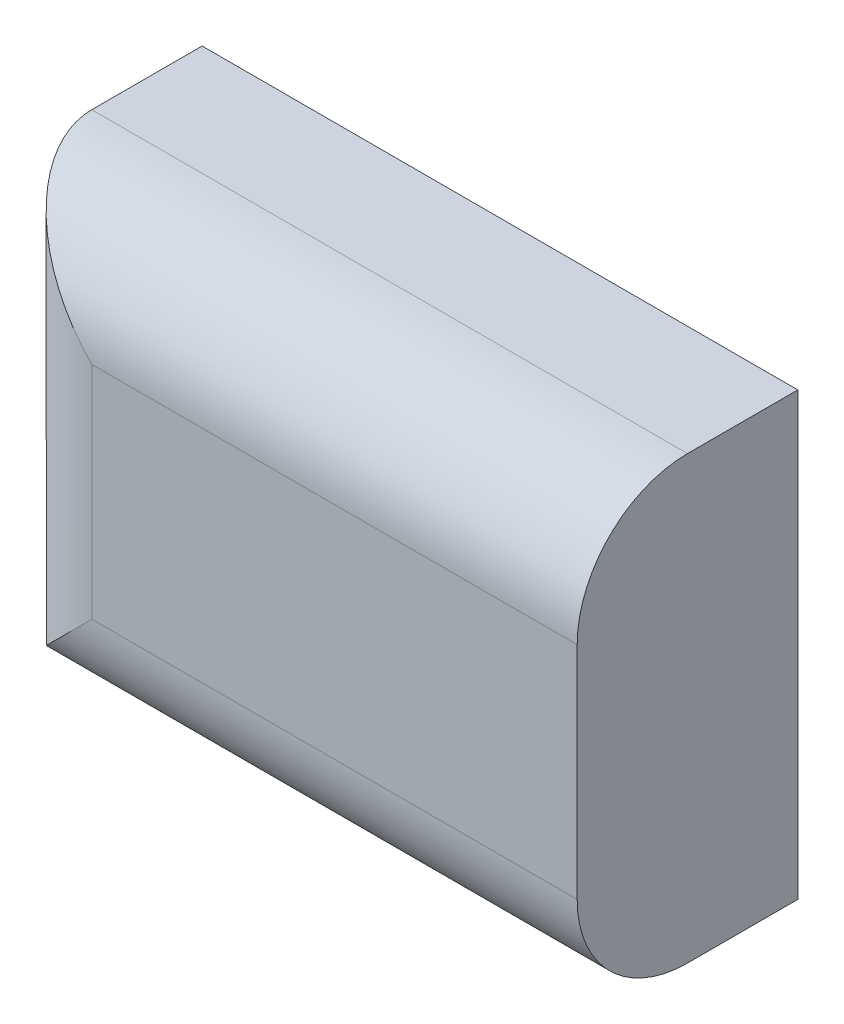
ISO-10303-21;
HEADER;
FILE_DESCRIPTION(('STEP AP214'),'2;1');
FILE_NAME('part.step','',(''),(''),'','','');
FILE_SCHEMA(('AUTOMOTIVE_DESIGN { 1 0 10303 214 1 1 1 1 }'));
ENDSEC;
DATA;
#1=APPLICATION_CONTEXT('core data for automotive mechanical design processes');
#2=APPLICATION_PROTOCOL_DEFINITION('international standard','automotive_design',2000,#1);
#3=PRODUCT_CONTEXT('',#1,'mechanical');
#4=PRODUCT('Part','Part','',(#3));
#5=PRODUCT_RELATED_PRODUCT_CATEGORY('part','',(#4));
#6=PRODUCT_DEFINITION_FORMATION('','',#4);
#7=PRODUCT_DEFINITION_CONTEXT('part definition',#1,'design');
#8=PRODUCT_DEFINITION('design','',#6,#7);
#9=PRODUCT_DEFINITION_SHAPE('','',#8);
#10=(LENGTH_UNIT() NAMED_UNIT(*) SI_UNIT(.MILLI.,.METRE.));
#11=(NAMED_UNIT(*) PLANE_ANGLE_UNIT() SI_UNIT($,.RADIAN.));
#12=(NAMED_UNIT(*) SI_UNIT($,.STERADIAN.) SOLID_ANGLE_UNIT());
#13=UNCERTAINTY_MEASURE_WITH_UNIT(LENGTH_MEASURE(1.E-05),#10,'distance_accuracy_value','');
#14=(GEOMETRIC_REPRESENTATION_CONTEXT(3) GLOBAL_UNCERTAINTY_ASSIGNED_CONTEXT((#13)) GLOBAL_UNIT_ASSIGNED_CONTEXT((#10,
#11,#12)) REPRESENTATION_CONTEXT('',''));
#15=CARTESIAN_POINT('',(0.,0.,0.));
#16=DIRECTION('',(0.,0.,1.));
#17=DIRECTION('',(1.,0.,0.));
#18=AXIS2_PLACEMENT_3D('',#15,#16,#17);
#19=CARTESIAN_POINT('',(171.45,-42.1410804547169,37.5167915155856));
#20=DIRECTION('',(0.,0.,-1.));
#21=DIRECTION('',(0.,1.,0.));
#22=AXIS2_PLACEMENT_3D('',#19,#20,#21);
#23=PLANE('',#22);
#24=DIRECTION('',(0.,-1.,0.));
#25=VECTOR('',#24,1.);
#26=CARTESIAN_POINT('',(31.75,-42.1410804547169,37.5167915155856));
#27=LINE('',#26,#25);
#28=CARTESIAN_POINT('',(31.75,53.1089195452831,37.5167915155856));
#29=VERTEX_POINT('',#28);
#30=CARTESIAN_POINT('',(31.75,-10.3910804547169,37.5167915155856));
#31=VERTEX_POINT('',#30);
#32=EDGE_CURVE('E119',#29,#31,#27,.T.);
#33=ORIENTED_EDGE('',*,*,#32,.T.);
#34=DIRECTION('',(-1.,0.,0.));
#35=VECTOR('',#34,1.);
#36=CARTESIAN_POINT('',(171.45,-10.3910804547169,37.5167915155856));
#37=LINE('',#36,#35);
#38=CARTESIAN_POINT('',(171.45,-10.3910804547169,37.5167915155856));
#39=VERTEX_POINT('',#38);
#40=EDGE_CURVE('E122',#31,#39,#37,.F.);
#41=ORIENTED_EDGE('',*,*,#40,.T.);
#42=DIRECTION('',(0.,-1.,0.));
#43=VECTOR('',#42,1.);
#44=CARTESIAN_POINT('',(171.45,-42.1410804547169,37.5167915155856));
#45=LINE('',#44,#43);
#46=CARTESIAN_POINT('',(171.45,53.1089195452831,37.5167915155856));
#47=VERTEX_POINT('',#46);
#48=EDGE_CURVE('E93',#47,#39,#45,.T.);
#49=ORIENTED_EDGE('',*,*,#48,.F.);
#50=DIRECTION('',(-1.,0.,0.));
#51=VECTOR('',#50,1.);
#52=CARTESIAN_POINT('',(171.45,53.1089195452831,37.5167915155856));
#53=LINE('',#52,#51);
#54=EDGE_CURVE('E102',#47,#29,#53,.T.);
#55=ORIENTED_EDGE('',*,*,#54,.T.);
#56=EDGE_LOOP('',(#33,#41,#49,#55));
#57=FACE_BOUND('',#56,.T.);
#58=ADVANCED_FACE('F33',(#57),#23,.F.);
#59=CARTESIAN_POINT('',(171.45,-42.1410804547169,37.5167915155856));
#60=DIRECTION('',(0.,1.,0.));
#61=DIRECTION('',(0.,0.,1.));
#62=AXIS2_PLACEMENT_3D('',#59,#60,#61);
#63=PLANE('',#62);
#64=DIRECTION('',(0.,0.,-1.));
#65=VECTOR('',#64,1.);
#66=CARTESIAN_POINT('',(171.45,-42.1410804547169,37.5167915155856));
#67=LINE('',#66,#65);
#68=CARTESIAN_POINT('',(171.45,-42.1410804547169,5.76679151558561));
#69=VERTEX_POINT('',#68);
#70=CARTESIAN_POINT('',(171.45,-42.1410804547169,-25.9832084844144));
#71=VERTEX_POINT('',#70);
#72=EDGE_CURVE('E85',#69,#71,#67,.T.);
#73=ORIENTED_EDGE('',*,*,#72,.F.);
#74=DIRECTION('',(-1.,0.,0.));
#75=VECTOR('',#74,1.);
#76=CARTESIAN_POINT('',(171.45,-42.1410804547169,5.76679151558561));
#77=LINE('',#76,#75);
#78=CARTESIAN_POINT('',(0.,-42.1410804547169,5.76679151558561));
#79=VERTEX_POINT('',#78);
#80=EDGE_CURVE('E126',#69,#79,#77,.T.);
#81=ORIENTED_EDGE('',*,*,#80,.T.);
#82=DIRECTION('',(0.,0.,-1.));
#83=VECTOR('',#82,1.);
#84=CARTESIAN_POINT('',(0.,-42.1410804547169,37.5167915155856));
#85=LINE('',#84,#83);
#86=CARTESIAN_POINT('',(0.,-42.1410804547169,-25.9832084844144));
#87=VERTEX_POINT('',#86);
#88=EDGE_CURVE('E99',#79,#87,#85,.T.);
#89=ORIENTED_EDGE('',*,*,#88,.T.);
#90=DIRECTION('',(-1.,0.,0.));
#91=VECTOR('',#90,1.);
#92=CARTESIAN_POINT('',(171.45,-42.1410804547169,-25.9832084844144));
#93=LINE('',#92,#91);
#94=EDGE_CURVE('E96',#71,#87,#93,.T.);
#95=ORIENTED_EDGE('',*,*,#94,.F.);
#96=EDGE_LOOP('',(#73,#81,#89,#95));
#97=FACE_BOUND('',#96,.T.);
#98=ADVANCED_FACE('F97',(#97),#63,.F.);
#99=CARTESIAN_POINT('',(171.45,84.8589195452831,-25.9832084844144));
#100=DIRECTION('',(0.,0.,1.));
#101=DIRECTION('',(0.,-1.,0.));
#102=AXIS2_PLACEMENT_3D('',#99,#100,#101);
#103=PLANE('',#102);
#104=DIRECTION('',(0.,1.,0.));
#105=VECTOR('',#104,1.);
#106=CARTESIAN_POINT('',(0.,84.8589195452831,-25.9832084844144));
#107=LINE('',#106,#105);
#108=CARTESIAN_POINT('',(0.,84.8589195452831,-25.9832084844144));
#109=VERTEX_POINT('',#108);
#110=EDGE_CURVE('E113',#87,#109,#107,.T.);
#111=ORIENTED_EDGE('',*,*,#110,.T.);
#112=DIRECTION('',(-1.,0.,0.));
#113=VECTOR('',#112,1.);
#114=CARTESIAN_POINT('',(171.45,84.8589195452831,-25.9832084844144));
#115=LINE('',#114,#113);
#116=CARTESIAN_POINT('',(171.45,84.8589195452831,-25.9832084844144));
#117=VERTEX_POINT('',#116);
#118=EDGE_CURVE('E103',#117,#109,#115,.T.);
#119=ORIENTED_EDGE('',*,*,#118,.F.);
#120=DIRECTION('',(0.,1.,0.));
#121=VECTOR('',#120,1.);
#122=CARTESIAN_POINT('',(171.45,84.8589195452831,-25.9832084844144));
#123=LINE('',#122,#121);
#124=EDGE_CURVE('E89',#71,#117,#123,.T.);
#125=ORIENTED_EDGE('',*,*,#124,.F.);
#126=ORIENTED_EDGE('',*,*,#94,.T.);
#127=EDGE_LOOP('',(#111,#119,#125,#126));
#128=FACE_BOUND('',#127,.T.);
#129=ADVANCED_FACE('F105',(#128),#103,.F.);
#130=CARTESIAN_POINT('',(171.45,84.8589195452831,-25.9832084844144));
#131=DIRECTION('',(0.,-1.,0.));
#132=DIRECTION('',(0.,0.,-1.));
#133=AXIS2_PLACEMENT_3D('',#130,#131,#132);
#134=PLANE('',#133);
#135=DIRECTION('',(0.,0.,1.));
#136=VECTOR('',#135,1.);
#137=CARTESIAN_POINT('',(0.,84.8589195452831,-25.9832084844144));
#138=LINE('',#137,#136);
#139=CARTESIAN_POINT('',(0.,84.8589195452831,5.76679151558562));
#140=VERTEX_POINT('',#139);
#141=EDGE_CURVE('E115',#109,#140,#138,.T.);
#142=ORIENTED_EDGE('',*,*,#141,.T.);
#143=DIRECTION('',(-1.,0.,0.));
#144=VECTOR('',#143,1.);
#145=CARTESIAN_POINT('',(171.45,84.8589195452831,5.76679151558562));
#146=LINE('',#145,#144);
#147=CARTESIAN_POINT('',(171.45,84.8589195452831,5.76679151558562));
#148=VERTEX_POINT('',#147);
#149=EDGE_CURVE('E11',#140,#148,#146,.F.);
#150=ORIENTED_EDGE('',*,*,#149,.T.);
#151=DIRECTION('',(0.,0.,1.));
#152=VECTOR('',#151,1.);
#153=CARTESIAN_POINT('',(171.45,84.8589195452831,-25.9832084844144));
#154=LINE('',#153,#152);
#155=EDGE_CURVE('E107',#117,#148,#154,.T.);
#156=ORIENTED_EDGE('',*,*,#155,.F.);
#157=ORIENTED_EDGE('',*,*,#118,.T.);
#158=EDGE_LOOP('',(#142,#150,#156,#157));
#159=FACE_BOUND('',#158,.T.);
#160=ADVANCED_FACE('F149',(#159),#134,.F.);
#161=CARTESIAN_POINT('',(171.45,0.,0.));
#162=DIRECTION('',(1.,0.,0.));
#163=DIRECTION('',(0.,0.,-1.));
#164=AXIS2_PLACEMENT_3D('',#161,#162,#163);
#165=PLANE('',#164);
#166=ORIENTED_EDGE('',*,*,#48,.T.);
#167=CARTESIAN_POINT('',(171.45,-10.3910804547169,5.76679151558561));
#168=DIRECTION('',(1.,0.,0.));
#169=DIRECTION('',(0.,0.,-1.));
#170=AXIS2_PLACEMENT_3D('',#167,#168,#169);
#171=CIRCLE('',#170,31.75);
#172=EDGE_CURVE('E42',#39,#69,#171,.T.);
#173=ORIENTED_EDGE('',*,*,#172,.T.);
#174=ORIENTED_EDGE('',*,*,#72,.T.);
#175=ORIENTED_EDGE('',*,*,#124,.T.);
#176=ORIENTED_EDGE('',*,*,#155,.T.);
#177=CARTESIAN_POINT('',(171.45,53.1089195452831,5.76679151558562));
#178=DIRECTION('',(1.,0.,0.));
#179=DIRECTION('',(0.,0.,-1.));
#180=AXIS2_PLACEMENT_3D('',#177,#178,#179);
#181=CIRCLE('',#180,31.75);
#182=EDGE_CURVE('E128',#148,#47,#181,.T.);
#183=ORIENTED_EDGE('',*,*,#182,.T.);
#184=EDGE_LOOP('',(#166,#173,#174,#175,#176,#183));
#185=FACE_BOUND('',#184,.T.);
#186=ADVANCED_FACE('F87',(#185),#165,.T.);
#187=CARTESIAN_POINT('',(0.,0.,0.));
#188=DIRECTION('',(1.,0.,0.));
#189=DIRECTION('',(0.,0.,-1.));
#190=AXIS2_PLACEMENT_3D('',#187,#188,#189);
#191=PLANE('',#190);
#192=ORIENTED_EDGE('',*,*,#88,.F.);
#193=DIRECTION('',(0.,-1.,0.));
#194=VECTOR('',#193,1.);
#195=CARTESIAN_POINT('',(0.,0.,5.76679151558561));
#196=LINE('',#195,#194);
#197=EDGE_CURVE('E124',#79,#140,#196,.F.);
#198=ORIENTED_EDGE('',*,*,#197,.T.);
#199=ORIENTED_EDGE('',*,*,#141,.F.);
#200=ORIENTED_EDGE('',*,*,#110,.F.);
#201=EDGE_LOOP('',(#192,#198,#199,#200));
#202=FACE_BOUND('',#201,.T.);
#203=ADVANCED_FACE('F147',(#202),#191,.F.);
#204=CARTESIAN_POINT('',(171.45,53.1089195452831,5.76679151558562));
#205=DIRECTION('',(-1.,0.,0.));
#206=DIRECTION('',(0.,0.,1.));
#207=AXIS2_PLACEMENT_3D('',#204,#205,#206);
#208=CYLINDRICAL_SURFACE('',#207,31.75);
#209=ORIENTED_EDGE('',*,*,#182,.F.);
#210=ORIENTED_EDGE('',*,*,#149,.F.);
#211=CARTESIAN_POINT('',(31.75,53.1089195452831,5.76679151558562));
#212=DIRECTION('',(-0.707106781186547,-0.707106781186547,0.));
#213=DIRECTION('',(-0.707106781186547,0.707106781186547,0.));
#214=AXIS2_PLACEMENT_3D('',#211,#212,#213);
#215=ELLIPSE('',#214,44.9012806053458,31.75);
#216=EDGE_CURVE('E37',#29,#140,#215,.T.);
#217=ORIENTED_EDGE('',*,*,#216,.F.);
#218=ORIENTED_EDGE('',*,*,#54,.F.);
#219=EDGE_LOOP('',(#209,#210,#217,#218));
#220=FACE_BOUND('',#219,.T.);
#221=ADVANCED_FACE('F35',(#220),#208,.T.);
#222=CARTESIAN_POINT('',(171.45,-10.3910804547169,5.76679151558561));
#223=DIRECTION('',(-1.,0.,0.));
#224=DIRECTION('',(0.,0.,1.));
#225=AXIS2_PLACEMENT_3D('',#222,#223,#224);
#226=CYLINDRICAL_SURFACE('',#225,31.75);
#227=ORIENTED_EDGE('',*,*,#172,.F.);
#228=ORIENTED_EDGE('',*,*,#40,.F.);
#229=CARTESIAN_POINT('',(31.75,-10.3910804547169,5.76679151558561));
#230=DIRECTION('',(-0.707106781186547,0.707106781186547,0.));
#231=DIRECTION('',(-0.707106781186547,-0.707106781186547,0.));
#232=AXIS2_PLACEMENT_3D('',#229,#230,#231);
#233=ELLIPSE('',#232,44.9012806053458,31.75);
#234=EDGE_CURVE('E130',#79,#31,#233,.T.);
#235=ORIENTED_EDGE('',*,*,#234,.F.);
#236=ORIENTED_EDGE('',*,*,#80,.F.);
#237=EDGE_LOOP('',(#227,#228,#235,#236));
#238=FACE_BOUND('',#237,.T.);
#239=ADVANCED_FACE('F145',(#238),#226,.T.);
#240=CARTESIAN_POINT('',(31.75,-42.1410804547169,5.76679151558561));
#241=DIRECTION('',(0.,-1.,0.));
#242=DIRECTION('',(0.,0.,-1.));
#243=AXIS2_PLACEMENT_3D('',#240,#241,#242);
#244=CYLINDRICAL_SURFACE('',#243,31.75);
#245=ORIENTED_EDGE('',*,*,#216,.T.);
#246=ORIENTED_EDGE('',*,*,#197,.F.);
#247=ORIENTED_EDGE('',*,*,#234,.T.);
#248=ORIENTED_EDGE('',*,*,#32,.F.);
#249=EDGE_LOOP('',(#245,#246,#247,#248));
#250=FACE_BOUND('',#249,.T.);
#251=ADVANCED_FACE('F138',(#250),#244,.T.);
#252=CLOSED_SHELL('',(#58,#98,#129,#160,#186,#203,#221,#239,#251));
#253=MANIFOLD_SOLID_BREP('B2',#252);
#254=ADVANCED_BREP_SHAPE_REPRESENTATION('',(#18,#253),#14);
#255=SHAPE_DEFINITION_REPRESENTATION(#9,#254);
ENDSEC;
END-ISO-10303-21;
